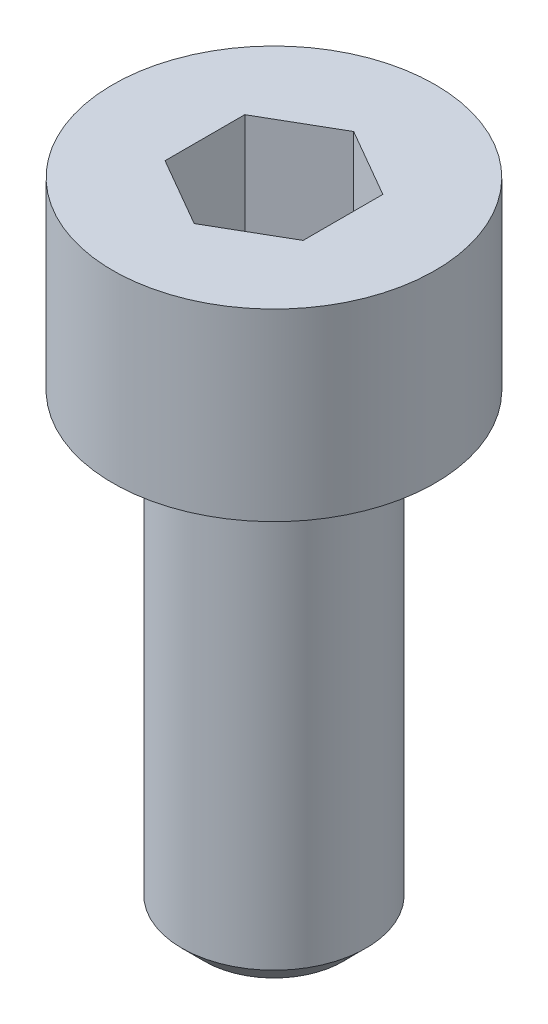
ISO-10303-21;
HEADER;
FILE_DESCRIPTION(('STEP AP214'),'2;1');
FILE_NAME('part.step','',(''),(''),'','','');
FILE_SCHEMA(('AUTOMOTIVE_DESIGN { 1 0 10303 214 1 1 1 1 }'));
ENDSEC;
DATA;
#1=APPLICATION_CONTEXT('core data for automotive mechanical design processes');
#2=APPLICATION_PROTOCOL_DEFINITION('international standard','automotive_design',2000,#1);
#3=PRODUCT_CONTEXT('',#1,'mechanical');
#4=PRODUCT('Part','Part','',(#3));
#5=PRODUCT_RELATED_PRODUCT_CATEGORY('part','',(#4));
#6=PRODUCT_DEFINITION_FORMATION('','',#4);
#7=PRODUCT_DEFINITION_CONTEXT('part definition',#1,'design');
#8=PRODUCT_DEFINITION('design','',#6,#7);
#9=PRODUCT_DEFINITION_SHAPE('','',#8);
#10=(LENGTH_UNIT() NAMED_UNIT(*) SI_UNIT(.MILLI.,.METRE.));
#11=(NAMED_UNIT(*) PLANE_ANGLE_UNIT() SI_UNIT($,.RADIAN.));
#12=(NAMED_UNIT(*) SI_UNIT($,.STERADIAN.) SOLID_ANGLE_UNIT());
#13=UNCERTAINTY_MEASURE_WITH_UNIT(LENGTH_MEASURE(1.E-05),#10,'distance_accuracy_value','');
#14=(GEOMETRIC_REPRESENTATION_CONTEXT(3) GLOBAL_UNCERTAINTY_ASSIGNED_CONTEXT((#13)) GLOBAL_UNIT_ASSIGNED_CONTEXT((#10,
#11,#12)) REPRESENTATION_CONTEXT('',''));
#15=CARTESIAN_POINT('',(0.,0.,0.));
#16=DIRECTION('',(0.,0.,1.));
#17=DIRECTION('',(1.,0.,0.));
#18=AXIS2_PLACEMENT_3D('',#15,#16,#17);
#19=CARTESIAN_POINT('',(1.5,1.5,-0.866025403784439));
#20=DIRECTION('',(0.5,0.,-0.866025403784439));
#21=DIRECTION('',(-0.866025403784439,0.,-0.5));
#22=AXIS2_PLACEMENT_3D('',#19,#20,#21);
#23=PLANE('',#22);
#24=DIRECTION('',(0.,1.,0.));
#25=VECTOR('',#24,1.);
#26=CARTESIAN_POINT('',(0.,1.5,-1.73205080756888));
#27=LINE('',#26,#25);
#28=CARTESIAN_POINT('',(0.,4.,-1.73205080756888));
#29=VERTEX_POINT('',#28);
#30=CARTESIAN_POINT('',(0.,1.5,-1.73205080756888));
#31=VERTEX_POINT('',#30);
#32=EDGE_CURVE('E83',#29,#31,#27,.F.);
#33=ORIENTED_EDGE('',*,*,#32,.T.);
#34=DIRECTION('',(-0.866025403784439,0.,-0.5));
#35=VECTOR('',#34,1.);
#36=CARTESIAN_POINT('',(1.5,1.5,-0.866025403784439));
#37=LINE('',#36,#35);
#38=CARTESIAN_POINT('',(1.5,1.5,-0.866025403784439));
#39=VERTEX_POINT('',#38);
#40=EDGE_CURVE('E72',#39,#31,#37,.T.);
#41=ORIENTED_EDGE('',*,*,#40,.F.);
#42=DIRECTION('',(0.,1.,0.));
#43=VECTOR('',#42,1.);
#44=CARTESIAN_POINT('',(1.5,1.5,-0.866025403784439));
#45=LINE('',#44,#43);
#46=CARTESIAN_POINT('',(1.5,4.,-0.866025403784439));
#47=VERTEX_POINT('',#46);
#48=EDGE_CURVE('E92',#39,#47,#45,.T.);
#49=ORIENTED_EDGE('',*,*,#48,.T.);
#50=DIRECTION('',(-0.866025403784439,0.,-0.5));
#51=VECTOR('',#50,1.);
#52=CARTESIAN_POINT('',(1.5,4.,-0.866025403784439));
#53=LINE('',#52,#51);
#54=EDGE_CURVE('E67',#29,#47,#53,.F.);
#55=ORIENTED_EDGE('',*,*,#54,.F.);
#56=EDGE_LOOP('',(#33,#41,#49,#55));
#57=FACE_BOUND('',#56,.T.);
#58=ADVANCED_FACE('F17',(#57),#23,.F.);
#59=CARTESIAN_POINT('',(0.,1.5,-1.73205080756888));
#60=DIRECTION('',(-0.5,0.,-0.866025403784439));
#61=DIRECTION('',(-0.866025403784439,0.,0.5));
#62=AXIS2_PLACEMENT_3D('',#59,#60,#61);
#63=PLANE('',#62);
#64=DIRECTION('',(0.,1.,0.));
#65=VECTOR('',#64,1.);
#66=CARTESIAN_POINT('',(-1.5,1.5,-0.866025403784439));
#67=LINE('',#66,#65);
#68=CARTESIAN_POINT('',(-1.5,4.,-0.86602540378444));
#69=VERTEX_POINT('',#68);
#70=CARTESIAN_POINT('',(-1.5,1.5,-0.866025403784439));
#71=VERTEX_POINT('',#70);
#72=EDGE_CURVE('E88',#69,#71,#67,.F.);
#73=ORIENTED_EDGE('',*,*,#72,.T.);
#74=DIRECTION('',(-0.866025403784439,0.,0.5));
#75=VECTOR('',#74,1.);
#76=CARTESIAN_POINT('',(0.,1.5,-1.73205080756888));
#77=LINE('',#76,#75);
#78=EDGE_CURVE('E76',#31,#71,#77,.T.);
#79=ORIENTED_EDGE('',*,*,#78,.F.);
#80=ORIENTED_EDGE('',*,*,#32,.F.);
#81=DIRECTION('',(-0.866025403784439,0.,0.5));
#82=VECTOR('',#81,1.);
#83=CARTESIAN_POINT('',(0.,4.,-1.73205080756888));
#84=LINE('',#83,#82);
#85=EDGE_CURVE('E90',#69,#29,#84,.F.);
#86=ORIENTED_EDGE('',*,*,#85,.F.);
#87=EDGE_LOOP('',(#73,#79,#80,#86));
#88=FACE_BOUND('',#87,.T.);
#89=ADVANCED_FACE('F86',(#88),#63,.F.);
#90=CARTESIAN_POINT('',(1.5,1.5,0.866025403784439));
#91=DIRECTION('',(1.,0.,0.));
#92=DIRECTION('',(0.,0.,-1.));
#93=AXIS2_PLACEMENT_3D('',#90,#91,#92);
#94=PLANE('',#93);
#95=ORIENTED_EDGE('',*,*,#48,.F.);
#96=DIRECTION('',(0.,0.,1.));
#97=VECTOR('',#96,1.);
#98=CARTESIAN_POINT('',(1.5,1.5,2.59807621135332));
#99=LINE('',#98,#97);
#100=CARTESIAN_POINT('',(1.5,1.5,0.866025403784439));
#101=VERTEX_POINT('',#100);
#102=EDGE_CURVE('E79',#101,#39,#99,.F.);
#103=ORIENTED_EDGE('',*,*,#102,.F.);
#104=DIRECTION('',(0.,1.,0.));
#105=VECTOR('',#104,1.);
#106=CARTESIAN_POINT('',(1.5,1.5,0.866025403784439));
#107=LINE('',#106,#105);
#108=CARTESIAN_POINT('',(1.5,4.,0.866025403784439));
#109=VERTEX_POINT('',#108);
#110=EDGE_CURVE('E119',#101,#109,#107,.T.);
#111=ORIENTED_EDGE('',*,*,#110,.T.);
#112=DIRECTION('',(0.,0.,-1.));
#113=VECTOR('',#112,1.);
#114=CARTESIAN_POINT('',(1.5,4.,0.866025403784439));
#115=LINE('',#114,#113);
#116=EDGE_CURVE('E130',#47,#109,#115,.F.);
#117=ORIENTED_EDGE('',*,*,#116,.F.);
#118=EDGE_LOOP('',(#95,#103,#111,#117));
#119=FACE_BOUND('',#118,.T.);
#120=ADVANCED_FACE('F133',(#119),#94,.F.);
#121=CARTESIAN_POINT('',(-1.5,1.5,-0.866025403784439));
#122=DIRECTION('',(-1.,0.,0.));
#123=DIRECTION('',(0.,0.,1.));
#124=AXIS2_PLACEMENT_3D('',#121,#122,#123);
#125=PLANE('',#124);
#126=DIRECTION('',(0.,1.,0.));
#127=VECTOR('',#126,1.);
#128=CARTESIAN_POINT('',(-1.5,1.5,0.866025403784439));
#129=LINE('',#128,#127);
#130=CARTESIAN_POINT('',(-1.5,4.,0.866025403784439));
#131=VERTEX_POINT('',#130);
#132=CARTESIAN_POINT('',(-1.5,1.5,0.866025403784439));
#133=VERTEX_POINT('',#132);
#134=EDGE_CURVE('E116',#131,#133,#129,.F.);
#135=ORIENTED_EDGE('',*,*,#134,.T.);
#136=DIRECTION('',(0.,0.,1.));
#137=VECTOR('',#136,1.);
#138=CARTESIAN_POINT('',(-1.5,1.5,2.59807621135332));
#139=LINE('',#138,#137);
#140=EDGE_CURVE('E125',#71,#133,#139,.T.);
#141=ORIENTED_EDGE('',*,*,#140,.F.);
#142=ORIENTED_EDGE('',*,*,#72,.F.);
#143=DIRECTION('',(0.,0.,1.));
#144=VECTOR('',#143,1.);
#145=CARTESIAN_POINT('',(-1.5,4.,-0.866025403784439));
#146=LINE('',#145,#144);
#147=EDGE_CURVE('E127',#131,#69,#146,.F.);
#148=ORIENTED_EDGE('',*,*,#147,.F.);
#149=EDGE_LOOP('',(#135,#141,#142,#148));
#150=FACE_BOUND('',#149,.T.);
#151=ADVANCED_FACE('F138',(#150),#125,.F.);
#152=CARTESIAN_POINT('',(-1.5,1.5,2.59807621135332));
#153=DIRECTION('',(0.,1.,0.));
#154=DIRECTION('',(0.,0.,1.));
#155=AXIS2_PLACEMENT_3D('',#152,#153,#154);
#156=PLANE('',#155);
#157=ORIENTED_EDGE('',*,*,#40,.T.);
#158=ORIENTED_EDGE('',*,*,#78,.T.);
#159=ORIENTED_EDGE('',*,*,#140,.T.);
#160=DIRECTION('',(0.866025403784439,0.,0.5));
#161=VECTOR('',#160,1.);
#162=CARTESIAN_POINT('',(-1.5,1.5,0.866025403784439));
#163=LINE('',#162,#161);
#164=CARTESIAN_POINT('',(0.,1.5,1.73205080756888));
#165=VERTEX_POINT('',#164);
#166=EDGE_CURVE('E111',#133,#165,#163,.T.);
#167=ORIENTED_EDGE('',*,*,#166,.T.);
#168=DIRECTION('',(0.866025403784439,0.,-0.5));
#169=VECTOR('',#168,1.);
#170=CARTESIAN_POINT('',(0.,1.5,1.73205080756888));
#171=LINE('',#170,#169);
#172=EDGE_CURVE('E122',#165,#101,#171,.T.);
#173=ORIENTED_EDGE('',*,*,#172,.T.);
#174=ORIENTED_EDGE('',*,*,#102,.T.);
#175=EDGE_LOOP('',(#157,#158,#159,#167,#173,#174));
#176=FACE_BOUND('',#175,.T.);
#177=ADVANCED_FACE('F73',(#176),#156,.T.);
#178=CARTESIAN_POINT('',(0.,1.5,1.73205080756888));
#179=DIRECTION('',(0.5,0.,0.866025403784439));
#180=DIRECTION('',(0.866025403784439,0.,-0.5));
#181=AXIS2_PLACEMENT_3D('',#178,#179,#180);
#182=PLANE('',#181);
#183=ORIENTED_EDGE('',*,*,#110,.F.);
#184=ORIENTED_EDGE('',*,*,#172,.F.);
#185=DIRECTION('',(0.,1.,0.));
#186=VECTOR('',#185,1.);
#187=CARTESIAN_POINT('',(0.,1.5,1.73205080756888));
#188=LINE('',#187,#186);
#189=CARTESIAN_POINT('',(0.,4.,1.73205080756888));
#190=VERTEX_POINT('',#189);
#191=EDGE_CURVE('E107',#165,#190,#188,.T.);
#192=ORIENTED_EDGE('',*,*,#191,.T.);
#193=DIRECTION('',(0.866025403784439,0.,-0.5));
#194=VECTOR('',#193,1.);
#195=CARTESIAN_POINT('',(0.,4.,1.73205080756888));
#196=LINE('',#195,#194);
#197=EDGE_CURVE('E35',#109,#190,#196,.F.);
#198=ORIENTED_EDGE('',*,*,#197,.F.);
#199=EDGE_LOOP('',(#183,#184,#192,#198));
#200=FACE_BOUND('',#199,.T.);
#201=ADVANCED_FACE('F145',(#200),#182,.F.);
#202=CARTESIAN_POINT('',(-1.5,1.5,0.866025403784439));
#203=DIRECTION('',(-0.5,0.,0.866025403784439));
#204=DIRECTION('',(0.866025403784439,0.,0.5));
#205=AXIS2_PLACEMENT_3D('',#202,#203,#204);
#206=PLANE('',#205);
#207=ORIENTED_EDGE('',*,*,#191,.F.);
#208=ORIENTED_EDGE('',*,*,#166,.F.);
#209=ORIENTED_EDGE('',*,*,#134,.F.);
#210=DIRECTION('',(-0.866025403784439,0.,-0.5));
#211=VECTOR('',#210,1.);
#212=CARTESIAN_POINT('',(0.,4.,1.73205080756888));
#213=LINE('',#212,#211);
#214=EDGE_CURVE('E104',#190,#131,#213,.T.);
#215=ORIENTED_EDGE('',*,*,#214,.F.);
#216=EDGE_LOOP('',(#207,#208,#209,#215));
#217=FACE_BOUND('',#216,.T.);
#218=ADVANCED_FACE('F143',(#217),#206,.F.);
#219=CARTESIAN_POINT('',(0.,4.,0.));
#220=DIRECTION('',(0.,1.,0.));
#221=DIRECTION('',(0.,0.,1.));
#222=AXIS2_PLACEMENT_3D('',#219,#220,#221);
#223=PLANE('',#222);
#224=CARTESIAN_POINT('',(0.,4.,0.));
#225=DIRECTION('',(0.,-1.,0.));
#226=DIRECTION('',(0.,0.,-1.));
#227=AXIS2_PLACEMENT_3D('',#224,#225,#226);
#228=CIRCLE('',#227,3.5);
#229=CARTESIAN_POINT('',(0.,4.,-3.5));
#230=VERTEX_POINT('',#229);
#231=EDGE_CURVE('E20',#230,#230,#228,.T.);
#232=ORIENTED_EDGE('',*,*,#231,.F.);
#233=EDGE_LOOP('',(#232));
#234=FACE_BOUND('',#233,.T.);
#235=ORIENTED_EDGE('',*,*,#197,.T.);
#236=ORIENTED_EDGE('',*,*,#214,.T.);
#237=ORIENTED_EDGE('',*,*,#147,.T.);
#238=ORIENTED_EDGE('',*,*,#85,.T.);
#239=ORIENTED_EDGE('',*,*,#54,.T.);
#240=ORIENTED_EDGE('',*,*,#116,.T.);
#241=EDGE_LOOP('',(#235,#236,#237,#238,#239,#240));
#242=FACE_BOUND('',#241,.T.);
#243=ADVANCED_FACE('F135',(#234,#242),#223,.T.);
#244=CARTESIAN_POINT('',(0.,-10.,0.));
#245=DIRECTION('',(0.,1.,0.));
#246=DIRECTION('',(0.,0.,1.));
#247=AXIS2_PLACEMENT_3D('',#244,#245,#246);
#248=PLANE('',#247);
#249=CARTESIAN_POINT('',(0.,-9.99999999993406,0.));
#250=DIRECTION('',(0.,1.,0.));
#251=DIRECTION('',(0.,0.,1.));
#252=AXIS2_PLACEMENT_3D('',#249,#250,#251);
#253=CIRCLE('',#252,1.49999999996453);
#254=CARTESIAN_POINT('',(0.,-9.99999999993406,1.49999999996453));
#255=VERTEX_POINT('',#254);
#256=EDGE_CURVE('E99',#255,#255,#253,.T.);
#257=ORIENTED_EDGE('',*,*,#256,.F.);
#258=EDGE_LOOP('',(#257));
#259=FACE_BOUND('',#258,.T.);
#260=ADVANCED_FACE('F174',(#259),#248,.F.);
#261=CARTESIAN_POINT('',(0.,4.,0.));
#262=DIRECTION('',(0.,-1.,0.));
#263=DIRECTION('',(0.,0.,-1.));
#264=AXIS2_PLACEMENT_3D('',#261,#262,#263);
#265=CYLINDRICAL_SURFACE('',#264,3.5);
#266=ORIENTED_EDGE('',*,*,#231,.T.);
#267=EDGE_LOOP('',(#266));
#268=FACE_BOUND('',#267,.T.);
#269=CARTESIAN_POINT('',(0.,0.,0.));
#270=DIRECTION('',(0.,-1.,0.));
#271=DIRECTION('',(0.,0.,-1.));
#272=AXIS2_PLACEMENT_3D('',#269,#270,#271);
#273=CIRCLE('',#272,3.5);
#274=CARTESIAN_POINT('',(0.,0.,-3.5));
#275=VERTEX_POINT('',#274);
#276=EDGE_CURVE('E97',#275,#275,#273,.F.);
#277=ORIENTED_EDGE('',*,*,#276,.T.);
#278=EDGE_LOOP('',(#277));
#279=FACE_BOUND('',#278,.T.);
#280=ADVANCED_FACE('F170',(#268,#279),#265,.T.);
#281=CARTESIAN_POINT('',(0.,-9.49999999994589,0.));
#282=DIRECTION('',(0.,1.,0.));
#283=DIRECTION('',(0.,0.,1.));
#284=AXIS2_PLACEMENT_3D('',#281,#282,#283);
#285=CONICAL_SURFACE('',#284,2.00000000000955,0.785398163454292);
#286=CARTESIAN_POINT('',(0.,-9.5,0.));
#287=DIRECTION('',(0.,1.,0.));
#288=DIRECTION('',(0.,0.,1.));
#289=AXIS2_PLACEMENT_3D('',#286,#287,#288);
#290=CIRCLE('',#289,2.);
#291=CARTESIAN_POINT('',(0.,-9.5,2.));
#292=VERTEX_POINT('',#291);
#293=EDGE_CURVE('E26',#292,#292,#290,.T.);
#294=ORIENTED_EDGE('',*,*,#293,.F.);
#295=EDGE_LOOP('',(#294));
#296=FACE_BOUND('',#295,.T.);
#297=ORIENTED_EDGE('',*,*,#256,.T.);
#298=EDGE_LOOP('',(#297));
#299=FACE_BOUND('',#298,.T.);
#300=ADVANCED_FACE('F163',(#296,#299),#285,.T.);
#301=CARTESIAN_POINT('',(0.,0.,0.));
#302=DIRECTION('',(0.,1.,0.));
#303=DIRECTION('',(0.,0.,1.));
#304=AXIS2_PLACEMENT_3D('',#301,#302,#303);
#305=PLANE('',#304);
#306=ORIENTED_EDGE('',*,*,#276,.F.);
#307=EDGE_LOOP('',(#306));
#308=FACE_BOUND('',#307,.T.);
#309=CARTESIAN_POINT('',(0.,0.,0.));
#310=DIRECTION('',(0.,1.,0.));
#311=DIRECTION('',(0.,0.,1.));
#312=AXIS2_PLACEMENT_3D('',#309,#310,#311);
#313=CIRCLE('',#312,2.);
#314=CARTESIAN_POINT('',(0.,0.,2.));
#315=VERTEX_POINT('',#314);
#316=EDGE_CURVE('E11',#315,#315,#313,.F.);
#317=ORIENTED_EDGE('',*,*,#316,.F.);
#318=EDGE_LOOP('',(#317));
#319=FACE_BOUND('',#318,.T.);
#320=ADVANCED_FACE('F157',(#308,#319),#305,.F.);
#321=CARTESIAN_POINT('',(0.,-10.,0.));
#322=DIRECTION('',(0.,1.,0.));
#323=DIRECTION('',(0.,0.,1.));
#324=AXIS2_PLACEMENT_3D('',#321,#322,#323);
#325=CYLINDRICAL_SURFACE('',#324,2.);
#326=ORIENTED_EDGE('',*,*,#316,.T.);
#327=EDGE_LOOP('',(#326));
#328=FACE_BOUND('',#327,.T.);
#329=ORIENTED_EDGE('',*,*,#293,.T.);
#330=EDGE_LOOP('',(#329));
#331=FACE_BOUND('',#330,.T.);
#332=ADVANCED_FACE('F155',(#328,#331),#325,.T.);
#333=CLOSED_SHELL('',(#58,#89,#120,#151,#177,#201,#218,#243,#260,#280,#300,#320,#332));
#334=MANIFOLD_SOLID_BREP('B1',#333);
#335=ADVANCED_BREP_SHAPE_REPRESENTATION('',(#18,#334),#14);
#336=SHAPE_DEFINITION_REPRESENTATION(#9,#335);
ENDSEC;
END-ISO-10303-21;
